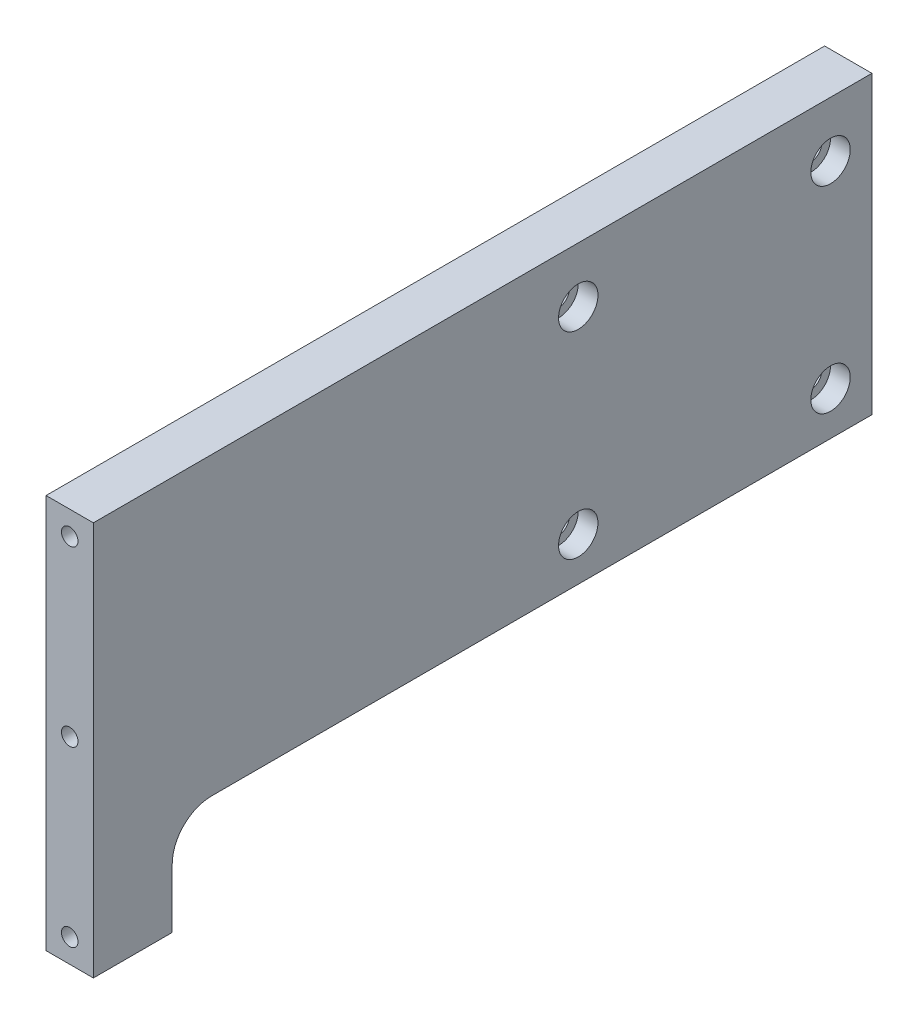
ISO-10303-21;
HEADER;
FILE_DESCRIPTION(('STEP AP214'),'2;1');
FILE_NAME('part.step','',(''),(''),'','','');
FILE_SCHEMA(('AUTOMOTIVE_DESIGN { 1 0 10303 214 1 1 1 1 }'));
ENDSEC;
DATA;
#1=APPLICATION_CONTEXT('core data for automotive mechanical design processes');
#2=APPLICATION_PROTOCOL_DEFINITION('international standard','automotive_design',2000,#1);
#3=PRODUCT_CONTEXT('',#1,'mechanical');
#4=PRODUCT('Part','Part','',(#3));
#5=PRODUCT_RELATED_PRODUCT_CATEGORY('part','',(#4));
#6=PRODUCT_DEFINITION_FORMATION('','',#4);
#7=PRODUCT_DEFINITION_CONTEXT('part definition',#1,'design');
#8=PRODUCT_DEFINITION('design','',#6,#7);
#9=PRODUCT_DEFINITION_SHAPE('','',#8);
#10=(LENGTH_UNIT() NAMED_UNIT(*) SI_UNIT(.MILLI.,.METRE.));
#11=(NAMED_UNIT(*) PLANE_ANGLE_UNIT() SI_UNIT($,.RADIAN.));
#12=(NAMED_UNIT(*) SI_UNIT($,.STERADIAN.) SOLID_ANGLE_UNIT());
#13=UNCERTAINTY_MEASURE_WITH_UNIT(LENGTH_MEASURE(1.E-05),#10,'distance_accuracy_value','');
#14=(GEOMETRIC_REPRESENTATION_CONTEXT(3) GLOBAL_UNCERTAINTY_ASSIGNED_CONTEXT((#13)) GLOBAL_UNIT_ASSIGNED_CONTEXT((#10,
#11,#12)) REPRESENTATION_CONTEXT('',''));
#15=CARTESIAN_POINT('',(0.,0.,0.));
#16=DIRECTION('',(0.,0.,1.));
#17=DIRECTION('',(1.,0.,0.));
#18=AXIS2_PLACEMENT_3D('',#15,#16,#17);
#19=CARTESIAN_POINT('',(12.,0.,0.));
#20=DIRECTION('',(0.,0.,-1.));
#21=DIRECTION('',(0.,1.,0.));
#22=AXIS2_PLACEMENT_3D('',#19,#20,#21);
#23=PLANE('',#22);
#24=CARTESIAN_POINT('',(6.,-6.,0.));
#25=DIRECTION('',(0.,0.,1.));
#26=DIRECTION('',(1.,0.,0.));
#27=AXIS2_PLACEMENT_3D('',#24,#25,#26);
#28=CIRCLE('',#27,2.09999999999999);
#29=CARTESIAN_POINT('',(8.09999999999999,-6.,0.));
#30=VERTEX_POINT('',#29);
#31=EDGE_CURVE('E113',#30,#30,#28,.T.);
#32=ORIENTED_EDGE('',*,*,#31,.F.);
#33=EDGE_LOOP('',(#32));
#34=FACE_BOUND('',#33,.T.);
#35=CARTESIAN_POINT('',(6.,-50.,0.));
#36=DIRECTION('',(0.,0.,1.));
#37=DIRECTION('',(1.,0.,0.));
#38=AXIS2_PLACEMENT_3D('',#35,#36,#37);
#39=CIRCLE('',#38,2.09999999999999);
#40=CARTESIAN_POINT('',(8.09999999999999,-50.,0.));
#41=VERTEX_POINT('',#40);
#42=EDGE_CURVE('E112',#41,#41,#39,.T.);
#43=ORIENTED_EDGE('',*,*,#42,.F.);
#44=EDGE_LOOP('',(#43));
#45=FACE_BOUND('',#44,.T.);
#46=CARTESIAN_POINT('',(6.,-94.,0.));
#47=DIRECTION('',(0.,0.,1.));
#48=DIRECTION('',(1.,0.,0.));
#49=AXIS2_PLACEMENT_3D('',#46,#47,#48);
#50=CIRCLE('',#49,2.09999999999999);
#51=CARTESIAN_POINT('',(8.09999999999999,-94.,0.));
#52=VERTEX_POINT('',#51);
#53=EDGE_CURVE('E125',#52,#52,#50,.T.);
#54=ORIENTED_EDGE('',*,*,#53,.F.);
#55=EDGE_LOOP('',(#54));
#56=FACE_BOUND('',#55,.T.);
#57=DIRECTION('',(0.,-1.,0.));
#58=VECTOR('',#57,1.);
#59=CARTESIAN_POINT('',(0.,0.,0.));
#60=LINE('',#59,#58);
#61=CARTESIAN_POINT('',(0.,0.,0.));
#62=VERTEX_POINT('',#61);
#63=CARTESIAN_POINT('',(0.,-100.,0.));
#64=VERTEX_POINT('',#63);
#65=EDGE_CURVE('E131',#62,#64,#60,.T.);
#66=ORIENTED_EDGE('',*,*,#65,.T.);
#67=DIRECTION('',(-1.,0.,0.));
#68=VECTOR('',#67,1.);
#69=CARTESIAN_POINT('',(12.,-100.,0.));
#70=LINE('',#69,#68);
#71=CARTESIAN_POINT('',(12.,-100.,0.));
#72=VERTEX_POINT('',#71);
#73=EDGE_CURVE('E169',#72,#64,#70,.T.);
#74=ORIENTED_EDGE('',*,*,#73,.F.);
#75=DIRECTION('',(0.,-1.,0.));
#76=VECTOR('',#75,1.);
#77=CARTESIAN_POINT('',(12.,0.,0.));
#78=LINE('',#77,#76);
#79=CARTESIAN_POINT('',(12.,0.,0.));
#80=VERTEX_POINT('',#79);
#81=EDGE_CURVE('E132',#80,#72,#78,.T.);
#82=ORIENTED_EDGE('',*,*,#81,.F.);
#83=DIRECTION('',(-1.,0.,0.));
#84=VECTOR('',#83,1.);
#85=CARTESIAN_POINT('',(12.,0.,0.));
#86=LINE('',#85,#84);
#87=EDGE_CURVE('E146',#80,#62,#86,.T.);
#88=ORIENTED_EDGE('',*,*,#87,.T.);
#89=EDGE_LOOP('',(#66,#74,#82,#88));
#90=FACE_BOUND('',#89,.T.);
#91=ADVANCED_FACE('F36',(#34,#45,#56,#90),#23,.F.);
#92=CARTESIAN_POINT('',(12.,-100.,0.));
#93=DIRECTION('',(0.,1.,0.));
#94=DIRECTION('',(0.,0.,1.));
#95=AXIS2_PLACEMENT_3D('',#92,#93,#94);
#96=PLANE('',#95);
#97=DIRECTION('',(0.,0.,-1.));
#98=VECTOR('',#97,1.);
#99=CARTESIAN_POINT('',(0.,-100.,0.));
#100=LINE('',#99,#98);
#101=CARTESIAN_POINT('',(0.,-100.,-20.));
#102=VERTEX_POINT('',#101);
#103=EDGE_CURVE('E149',#64,#102,#100,.T.);
#104=ORIENTED_EDGE('',*,*,#103,.T.);
#105=DIRECTION('',(-1.,0.,0.));
#106=VECTOR('',#105,1.);
#107=CARTESIAN_POINT('',(12.,-100.,-20.));
#108=LINE('',#107,#106);
#109=CARTESIAN_POINT('',(12.,-100.,-20.));
#110=VERTEX_POINT('',#109);
#111=EDGE_CURVE('E166',#110,#102,#108,.T.);
#112=ORIENTED_EDGE('',*,*,#111,.F.);
#113=DIRECTION('',(0.,0.,-1.));
#114=VECTOR('',#113,1.);
#115=CARTESIAN_POINT('',(12.,-100.,0.));
#116=LINE('',#115,#114);
#117=EDGE_CURVE('E135',#72,#110,#116,.T.);
#118=ORIENTED_EDGE('',*,*,#117,.F.);
#119=ORIENTED_EDGE('',*,*,#73,.T.);
#120=EDGE_LOOP('',(#104,#112,#118,#119));
#121=FACE_BOUND('',#120,.T.);
#122=ADVANCED_FACE('F210',(#121),#96,.F.);
#123=CARTESIAN_POINT('',(12.,-75.,-20.));
#124=DIRECTION('',(0.,0.,1.));
#125=DIRECTION('',(0.,-1.,0.));
#126=AXIS2_PLACEMENT_3D('',#123,#124,#125);
#127=PLANE('',#126);
#128=DIRECTION('',(0.,1.,0.));
#129=VECTOR('',#128,1.);
#130=CARTESIAN_POINT('',(0.,-75.,-20.));
#131=LINE('',#130,#129);
#132=CARTESIAN_POINT('',(0.,-85.,-20.));
#133=VERTEX_POINT('',#132);
#134=EDGE_CURVE('E151',#102,#133,#131,.T.);
#135=ORIENTED_EDGE('',*,*,#134,.T.);
#136=DIRECTION('',(-1.,0.,0.));
#137=VECTOR('',#136,1.);
#138=CARTESIAN_POINT('',(12.,-85.,-20.));
#139=LINE('',#138,#137);
#140=CARTESIAN_POINT('',(12.,-85.,-20.));
#141=VERTEX_POINT('',#140);
#142=EDGE_CURVE('E51',#133,#141,#139,.F.);
#143=ORIENTED_EDGE('',*,*,#142,.T.);
#144=DIRECTION('',(0.,1.,0.));
#145=VECTOR('',#144,1.);
#146=CARTESIAN_POINT('',(12.,-75.,-20.));
#147=LINE('',#146,#145);
#148=EDGE_CURVE('E138',#110,#141,#147,.T.);
#149=ORIENTED_EDGE('',*,*,#148,.F.);
#150=ORIENTED_EDGE('',*,*,#111,.T.);
#151=EDGE_LOOP('',(#135,#143,#149,#150));
#152=FACE_BOUND('',#151,.T.);
#153=ADVANCED_FACE('F215',(#152),#127,.F.);
#154=CARTESIAN_POINT('',(12.,-75.,-197.5));
#155=DIRECTION('',(0.,1.,0.));
#156=DIRECTION('',(0.,0.,1.));
#157=AXIS2_PLACEMENT_3D('',#154,#155,#156);
#158=PLANE('',#157);
#159=DIRECTION('',(0.,0.,-1.));
#160=VECTOR('',#159,1.);
#161=CARTESIAN_POINT('',(12.,-75.,-197.5));
#162=LINE('',#161,#160);
#163=CARTESIAN_POINT('',(12.,-75.,-30.));
#164=VERTEX_POINT('',#163);
#165=CARTESIAN_POINT('',(12.,-75.,-197.5));
#166=VERTEX_POINT('',#165);
#167=EDGE_CURVE('E140',#164,#166,#162,.T.);
#168=ORIENTED_EDGE('',*,*,#167,.F.);
#169=DIRECTION('',(-1.,0.,0.));
#170=VECTOR('',#169,1.);
#171=CARTESIAN_POINT('',(0.,-75.,-30.));
#172=LINE('',#171,#170);
#173=CARTESIAN_POINT('',(0.,-75.,-30.));
#174=VERTEX_POINT('',#173);
#175=EDGE_CURVE('E172',#164,#174,#172,.T.);
#176=ORIENTED_EDGE('',*,*,#175,.T.);
#177=DIRECTION('',(0.,0.,-1.));
#178=VECTOR('',#177,1.);
#179=CARTESIAN_POINT('',(0.,-75.,-197.5));
#180=LINE('',#179,#178);
#181=CARTESIAN_POINT('',(0.,-75.,-197.5));
#182=VERTEX_POINT('',#181);
#183=EDGE_CURVE('E153',#174,#182,#180,.T.);
#184=ORIENTED_EDGE('',*,*,#183,.T.);
#185=DIRECTION('',(-1.,0.,0.));
#186=VECTOR('',#185,1.);
#187=CARTESIAN_POINT('',(12.,-75.,-197.5));
#188=LINE('',#187,#186);
#189=EDGE_CURVE('E163',#166,#182,#188,.T.);
#190=ORIENTED_EDGE('',*,*,#189,.F.);
#191=EDGE_LOOP('',(#168,#176,#184,#190));
#192=FACE_BOUND('',#191,.T.);
#193=ADVANCED_FACE('F178',(#192),#158,.F.);
#194=CARTESIAN_POINT('',(12.,0.,-197.5));
#195=DIRECTION('',(0.,0.,1.));
#196=DIRECTION('',(1.,0.,0.));
#197=AXIS2_PLACEMENT_3D('',#194,#195,#196);
#198=PLANE('',#197);
#199=DIRECTION('',(0.,1.,0.));
#200=VECTOR('',#199,1.);
#201=CARTESIAN_POINT('',(0.,0.,-197.5));
#202=LINE('',#201,#200);
#203=CARTESIAN_POINT('',(0.,0.,-197.5));
#204=VERTEX_POINT('',#203);
#205=EDGE_CURVE('E155',#182,#204,#202,.T.);
#206=ORIENTED_EDGE('',*,*,#205,.T.);
#207=DIRECTION('',(-1.,0.,0.));
#208=VECTOR('',#207,1.);
#209=CARTESIAN_POINT('',(12.,0.,-197.5));
#210=LINE('',#209,#208);
#211=CARTESIAN_POINT('',(12.,0.,-197.5));
#212=VERTEX_POINT('',#211);
#213=EDGE_CURVE('E160',#212,#204,#210,.T.);
#214=ORIENTED_EDGE('',*,*,#213,.F.);
#215=DIRECTION('',(0.,1.,0.));
#216=VECTOR('',#215,1.);
#217=CARTESIAN_POINT('',(12.,0.,-197.5));
#218=LINE('',#217,#216);
#219=EDGE_CURVE('E142',#166,#212,#218,.T.);
#220=ORIENTED_EDGE('',*,*,#219,.F.);
#221=ORIENTED_EDGE('',*,*,#189,.T.);
#222=EDGE_LOOP('',(#206,#214,#220,#221));
#223=FACE_BOUND('',#222,.T.);
#224=ADVANCED_FACE('F188',(#223),#198,.F.);
#225=CARTESIAN_POINT('',(12.,0.,0.));
#226=DIRECTION('',(0.,-1.,0.));
#227=DIRECTION('',(0.,0.,-1.));
#228=AXIS2_PLACEMENT_3D('',#225,#226,#227);
#229=PLANE('',#228);
#230=DIRECTION('',(0.,0.,1.));
#231=VECTOR('',#230,1.);
#232=CARTESIAN_POINT('',(0.,0.,0.));
#233=LINE('',#232,#231);
#234=EDGE_CURVE('E136',#204,#62,#233,.T.);
#235=ORIENTED_EDGE('',*,*,#234,.T.);
#236=ORIENTED_EDGE('',*,*,#87,.F.);
#237=DIRECTION('',(0.,0.,1.));
#238=VECTOR('',#237,1.);
#239=CARTESIAN_POINT('',(12.,0.,0.));
#240=LINE('',#239,#238);
#241=EDGE_CURVE('E144',#212,#80,#240,.T.);
#242=ORIENTED_EDGE('',*,*,#241,.F.);
#243=ORIENTED_EDGE('',*,*,#213,.T.);
#244=EDGE_LOOP('',(#235,#236,#242,#243));
#245=FACE_BOUND('',#244,.T.);
#246=ADVANCED_FACE('F192',(#245),#229,.F.);
#247=CARTESIAN_POINT('',(12.,-100.,0.));
#248=DIRECTION('',(1.,0.,0.));
#249=DIRECTION('',(0.,0.,-1.));
#250=AXIS2_PLACEMENT_3D('',#247,#248,#249);
#251=PLANE('',#250);
#252=CARTESIAN_POINT('',(12.,-14.,-123.));
#253=DIRECTION('',(1.,0.,0.));
#254=DIRECTION('',(0.,0.,-1.));
#255=AXIS2_PLACEMENT_3D('',#252,#253,#254);
#256=CIRCLE('',#255,4.99999999999999);
#257=CARTESIAN_POINT('',(12.,-14.,-128.));
#258=VERTEX_POINT('',#257);
#259=EDGE_CURVE('E299',#258,#258,#256,.T.);
#260=ORIENTED_EDGE('',*,*,#259,.F.);
#261=EDGE_LOOP('',(#260));
#262=FACE_BOUND('',#261,.T.);
#263=CARTESIAN_POINT('',(12.,-64.,-123.));
#264=DIRECTION('',(1.,0.,0.));
#265=DIRECTION('',(0.,0.,-1.));
#266=AXIS2_PLACEMENT_3D('',#263,#264,#265);
#267=CIRCLE('',#266,4.99999999999999);
#268=CARTESIAN_POINT('',(12.,-64.,-128.));
#269=VERTEX_POINT('',#268);
#270=EDGE_CURVE('E309',#269,#269,#267,.T.);
#271=ORIENTED_EDGE('',*,*,#270,.F.);
#272=EDGE_LOOP('',(#271));
#273=FACE_BOUND('',#272,.T.);
#274=CARTESIAN_POINT('',(12.,-64.,-187.));
#275=DIRECTION('',(1.,0.,0.));
#276=DIRECTION('',(0.,0.,-1.));
#277=AXIS2_PLACEMENT_3D('',#274,#275,#276);
#278=CIRCLE('',#277,4.99999999999999);
#279=CARTESIAN_POINT('',(12.,-64.,-192.));
#280=VERTEX_POINT('',#279);
#281=EDGE_CURVE('E321',#280,#280,#278,.T.);
#282=ORIENTED_EDGE('',*,*,#281,.F.);
#283=EDGE_LOOP('',(#282));
#284=FACE_BOUND('',#283,.T.);
#285=CARTESIAN_POINT('',(12.,-14.,-187.));
#286=DIRECTION('',(1.,0.,0.));
#287=DIRECTION('',(0.,0.,-1.));
#288=AXIS2_PLACEMENT_3D('',#285,#286,#287);
#289=CIRCLE('',#288,4.99999999999999);
#290=CARTESIAN_POINT('',(12.,-14.,-192.));
#291=VERTEX_POINT('',#290);
#292=EDGE_CURVE('E333',#291,#291,#289,.T.);
#293=ORIENTED_EDGE('',*,*,#292,.F.);
#294=EDGE_LOOP('',(#293));
#295=FACE_BOUND('',#294,.T.);
#296=ORIENTED_EDGE('',*,*,#81,.T.);
#297=ORIENTED_EDGE('',*,*,#117,.T.);
#298=ORIENTED_EDGE('',*,*,#148,.T.);
#299=CARTESIAN_POINT('',(12.,-85.,-30.));
#300=DIRECTION('',(1.,0.,0.));
#301=DIRECTION('',(0.,0.,-1.));
#302=AXIS2_PLACEMENT_3D('',#299,#300,#301);
#303=CIRCLE('',#302,10.);
#304=EDGE_CURVE('E11',#141,#164,#303,.F.);
#305=ORIENTED_EDGE('',*,*,#304,.T.);
#306=ORIENTED_EDGE('',*,*,#167,.T.);
#307=ORIENTED_EDGE('',*,*,#219,.T.);
#308=ORIENTED_EDGE('',*,*,#241,.T.);
#309=EDGE_LOOP('',(#296,#297,#298,#305,#306,#307,#308));
#310=FACE_BOUND('',#309,.T.);
#311=ADVANCED_FACE('F196',(#262,#273,#284,#295,#310),#251,.T.);
#312=CARTESIAN_POINT('',(0.,-100.,0.));
#313=DIRECTION('',(1.,0.,0.));
#314=DIRECTION('',(0.,0.,-1.));
#315=AXIS2_PLACEMENT_3D('',#312,#313,#314);
#316=PLANE('',#315);
#317=CARTESIAN_POINT('',(0.,-14.,-123.));
#318=DIRECTION('',(1.,0.,0.));
#319=DIRECTION('',(0.,0.,-1.));
#320=AXIS2_PLACEMENT_3D('',#317,#318,#319);
#321=CIRCLE('',#320,2.75);
#322=CARTESIAN_POINT('',(0.,-14.,-125.75));
#323=VERTEX_POINT('',#322);
#324=EDGE_CURVE('E306',#323,#323,#321,.T.);
#325=ORIENTED_EDGE('',*,*,#324,.T.);
#326=EDGE_LOOP('',(#325));
#327=FACE_BOUND('',#326,.T.);
#328=CARTESIAN_POINT('',(0.,-64.,-123.));
#329=DIRECTION('',(1.,0.,0.));
#330=DIRECTION('',(0.,0.,-1.));
#331=AXIS2_PLACEMENT_3D('',#328,#329,#330);
#332=CIRCLE('',#331,2.75);
#333=CARTESIAN_POINT('',(0.,-64.,-125.75));
#334=VERTEX_POINT('',#333);
#335=EDGE_CURVE('E318',#334,#334,#332,.T.);
#336=ORIENTED_EDGE('',*,*,#335,.T.);
#337=EDGE_LOOP('',(#336));
#338=FACE_BOUND('',#337,.T.);
#339=CARTESIAN_POINT('',(0.,-64.,-187.));
#340=DIRECTION('',(1.,0.,0.));
#341=DIRECTION('',(0.,0.,-1.));
#342=AXIS2_PLACEMENT_3D('',#339,#340,#341);
#343=CIRCLE('',#342,2.75);
#344=CARTESIAN_POINT('',(0.,-64.,-189.75));
#345=VERTEX_POINT('',#344);
#346=EDGE_CURVE('E330',#345,#345,#343,.T.);
#347=ORIENTED_EDGE('',*,*,#346,.T.);
#348=EDGE_LOOP('',(#347));
#349=FACE_BOUND('',#348,.T.);
#350=CARTESIAN_POINT('',(0.,-14.,-187.));
#351=DIRECTION('',(1.,0.,0.));
#352=DIRECTION('',(0.,0.,-1.));
#353=AXIS2_PLACEMENT_3D('',#350,#351,#352);
#354=CIRCLE('',#353,2.75);
#355=CARTESIAN_POINT('',(0.,-14.,-189.75));
#356=VERTEX_POINT('',#355);
#357=EDGE_CURVE('E119',#356,#356,#354,.T.);
#358=ORIENTED_EDGE('',*,*,#357,.T.);
#359=EDGE_LOOP('',(#358));
#360=FACE_BOUND('',#359,.T.);
#361=ORIENTED_EDGE('',*,*,#65,.F.);
#362=ORIENTED_EDGE('',*,*,#234,.F.);
#363=ORIENTED_EDGE('',*,*,#205,.F.);
#364=ORIENTED_EDGE('',*,*,#183,.F.);
#365=CARTESIAN_POINT('',(0.,-85.,-30.));
#366=DIRECTION('',(1.,0.,0.));
#367=DIRECTION('',(0.,0.,-1.));
#368=AXIS2_PLACEMENT_3D('',#365,#366,#367);
#369=CIRCLE('',#368,10.);
#370=EDGE_CURVE('E44',#174,#133,#369,.T.);
#371=ORIENTED_EDGE('',*,*,#370,.T.);
#372=ORIENTED_EDGE('',*,*,#134,.F.);
#373=ORIENTED_EDGE('',*,*,#103,.F.);
#374=EDGE_LOOP('',(#361,#362,#363,#364,#371,#372,#373));
#375=FACE_BOUND('',#374,.T.);
#376=ADVANCED_FACE('F184',(#327,#338,#349,#360,#375),#316,.F.);
#377=CARTESIAN_POINT('',(12.,-85.,-30.));
#378=DIRECTION('',(1.,0.,0.));
#379=DIRECTION('',(0.,0.,-1.));
#380=AXIS2_PLACEMENT_3D('',#377,#378,#379);
#381=CYLINDRICAL_SURFACE('',#380,10.);
#382=ORIENTED_EDGE('',*,*,#304,.F.);
#383=ORIENTED_EDGE('',*,*,#142,.F.);
#384=ORIENTED_EDGE('',*,*,#370,.F.);
#385=ORIENTED_EDGE('',*,*,#175,.F.);
#386=EDGE_LOOP('',(#382,#383,#384,#385));
#387=FACE_BOUND('',#386,.T.);
#388=ADVANCED_FACE('F38',(#387),#381,.F.);
#389=CARTESIAN_POINT('',(6.,-94.,-14.));
#390=DIRECTION('',(0.,0.,1.));
#391=DIRECTION('',(1.,0.,0.));
#392=AXIS2_PLACEMENT_3D('',#389,#390,#391);
#393=CONICAL_SURFACE('',#392,2.09999999999999,1.02974425867665);
#394=CARTESIAN_POINT('',(6.,-94.,-15.2618072999579));
#395=VERTEX_POINT('',#394);
#396=VERTEX_LOOP('',#395);
#397=FACE_BOUND('',#396,.T.);
#398=CARTESIAN_POINT('',(6.,-94.,-14.));
#399=DIRECTION('',(0.,0.,1.));
#400=DIRECTION('',(1.,0.,0.));
#401=AXIS2_PLACEMENT_3D('',#398,#399,#400);
#402=CIRCLE('',#401,2.09999999999999);
#403=CARTESIAN_POINT('',(8.09999999999999,-94.,-14.));
#404=VERTEX_POINT('',#403);
#405=EDGE_CURVE('E128',#404,#404,#402,.T.);
#406=ORIENTED_EDGE('',*,*,#405,.T.);
#407=EDGE_LOOP('',(#406));
#408=FACE_BOUND('',#407,.T.);
#409=ADVANCED_FACE('F199',(#397,#408),#393,.F.);
#410=CARTESIAN_POINT('',(6.,-94.,0.));
#411=DIRECTION('',(0.,0.,1.));
#412=DIRECTION('',(1.,0.,0.));
#413=AXIS2_PLACEMENT_3D('',#410,#411,#412);
#414=CYLINDRICAL_SURFACE('',#413,2.09999999999999);
#415=ORIENTED_EDGE('',*,*,#405,.F.);
#416=EDGE_LOOP('',(#415));
#417=FACE_BOUND('',#416,.T.);
#418=ORIENTED_EDGE('',*,*,#53,.T.);
#419=EDGE_LOOP('',(#418));
#420=FACE_BOUND('',#419,.T.);
#421=ADVANCED_FACE('F204',(#417,#420),#414,.F.);
#422=CARTESIAN_POINT('',(6.,-50.,-14.));
#423=DIRECTION('',(0.,0.,1.));
#424=DIRECTION('',(1.,0.,0.));
#425=AXIS2_PLACEMENT_3D('',#422,#423,#424);
#426=CONICAL_SURFACE('',#425,2.09999999999999,1.02974425867665);
#427=CARTESIAN_POINT('',(6.,-50.,-15.2618072999579));
#428=VERTEX_POINT('',#427);
#429=VERTEX_LOOP('',#428);
#430=FACE_BOUND('',#429,.T.);
#431=CARTESIAN_POINT('',(6.,-50.,-14.));
#432=DIRECTION('',(0.,0.,1.));
#433=DIRECTION('',(1.,0.,0.));
#434=AXIS2_PLACEMENT_3D('',#431,#432,#433);
#435=CIRCLE('',#434,2.09999999999999);
#436=CARTESIAN_POINT('',(8.09999999999999,-50.,-14.));
#437=VERTEX_POINT('',#436);
#438=EDGE_CURVE('E116',#437,#437,#435,.T.);
#439=ORIENTED_EDGE('',*,*,#438,.T.);
#440=EDGE_LOOP('',(#439));
#441=FACE_BOUND('',#440,.T.);
#442=ADVANCED_FACE('F234',(#430,#441),#426,.F.);
#443=CARTESIAN_POINT('',(6.,-50.,0.));
#444=DIRECTION('',(0.,0.,1.));
#445=DIRECTION('',(1.,0.,0.));
#446=AXIS2_PLACEMENT_3D('',#443,#444,#445);
#447=CYLINDRICAL_SURFACE('',#446,2.09999999999999);
#448=ORIENTED_EDGE('',*,*,#438,.F.);
#449=EDGE_LOOP('',(#448));
#450=FACE_BOUND('',#449,.T.);
#451=ORIENTED_EDGE('',*,*,#42,.T.);
#452=EDGE_LOOP('',(#451));
#453=FACE_BOUND('',#452,.T.);
#454=ADVANCED_FACE('F106',(#450,#453),#447,.F.);
#455=CARTESIAN_POINT('',(6.,-6.,-14.));
#456=DIRECTION('',(0.,0.,1.));
#457=DIRECTION('',(1.,0.,0.));
#458=AXIS2_PLACEMENT_3D('',#455,#456,#457);
#459=CONICAL_SURFACE('',#458,2.09999999999999,1.02974425867665);
#460=CARTESIAN_POINT('',(6.,-6.,-15.2618072999579));
#461=VERTEX_POINT('',#460);
#462=VERTEX_LOOP('',#461);
#463=FACE_BOUND('',#462,.T.);
#464=CARTESIAN_POINT('',(6.,-6.,-14.));
#465=DIRECTION('',(0.,0.,1.));
#466=DIRECTION('',(1.,0.,0.));
#467=AXIS2_PLACEMENT_3D('',#464,#465,#466);
#468=CIRCLE('',#467,2.09999999999999);
#469=CARTESIAN_POINT('',(8.09999999999999,-6.,-14.));
#470=VERTEX_POINT('',#469);
#471=EDGE_CURVE('E110',#470,#470,#468,.T.);
#472=ORIENTED_EDGE('',*,*,#471,.T.);
#473=EDGE_LOOP('',(#472));
#474=FACE_BOUND('',#473,.T.);
#475=ADVANCED_FACE('F102',(#463,#474),#459,.F.);
#476=CARTESIAN_POINT('',(6.,-6.,0.));
#477=DIRECTION('',(0.,0.,1.));
#478=DIRECTION('',(1.,0.,0.));
#479=AXIS2_PLACEMENT_3D('',#476,#477,#478);
#480=CYLINDRICAL_SURFACE('',#479,2.09999999999999);
#481=ORIENTED_EDGE('',*,*,#471,.F.);
#482=EDGE_LOOP('',(#481));
#483=FACE_BOUND('',#482,.T.);
#484=ORIENTED_EDGE('',*,*,#31,.T.);
#485=EDGE_LOOP('',(#484));
#486=FACE_BOUND('',#485,.T.);
#487=ADVANCED_FACE('F105',(#483,#486),#480,.F.);
#488=CARTESIAN_POINT('',(12.,-14.,-187.));
#489=DIRECTION('',(1.,0.,0.));
#490=DIRECTION('',(0.,0.,-1.));
#491=AXIS2_PLACEMENT_3D('',#488,#489,#490);
#492=CYLINDRICAL_SURFACE('',#491,2.75);
#493=ORIENTED_EDGE('',*,*,#357,.F.);
#494=EDGE_LOOP('',(#493));
#495=FACE_BOUND('',#494,.T.);
#496=CARTESIAN_POINT('',(7.,-14.,-187.));
#497=DIRECTION('',(1.,0.,0.));
#498=DIRECTION('',(0.,0.,-1.));
#499=AXIS2_PLACEMENT_3D('',#496,#497,#498);
#500=CIRCLE('',#499,2.75000000000001);
#501=CARTESIAN_POINT('',(7.,-14.,-189.75));
#502=VERTEX_POINT('',#501);
#503=EDGE_CURVE('E339',#502,#502,#500,.T.);
#504=ORIENTED_EDGE('',*,*,#503,.T.);
#505=EDGE_LOOP('',(#504));
#506=FACE_BOUND('',#505,.T.);
#507=ADVANCED_FACE('F244',(#495,#506),#492,.F.);
#508=CARTESIAN_POINT('',(7.,-11.25,-187.));
#509=DIRECTION('',(-1.,0.,0.));
#510=DIRECTION('',(0.,0.,1.));
#511=AXIS2_PLACEMENT_3D('',#508,#509,#510);
#512=PLANE('',#511);
#513=ORIENTED_EDGE('',*,*,#503,.F.);
#514=EDGE_LOOP('',(#513));
#515=FACE_BOUND('',#514,.T.);
#516=CARTESIAN_POINT('',(7.,-14.,-187.));
#517=DIRECTION('',(1.,0.,0.));
#518=DIRECTION('',(0.,0.,-1.));
#519=AXIS2_PLACEMENT_3D('',#516,#517,#518);
#520=CIRCLE('',#519,4.99999999999999);
#521=CARTESIAN_POINT('',(7.,-14.,-192.));
#522=VERTEX_POINT('',#521);
#523=EDGE_CURVE('E336',#522,#522,#520,.T.);
#524=ORIENTED_EDGE('',*,*,#523,.T.);
#525=EDGE_LOOP('',(#524));
#526=FACE_BOUND('',#525,.T.);
#527=ADVANCED_FACE('F247',(#515,#526),#512,.F.);
#528=CARTESIAN_POINT('',(12.,-14.,-187.));
#529=DIRECTION('',(1.,0.,0.));
#530=DIRECTION('',(0.,0.,-1.));
#531=AXIS2_PLACEMENT_3D('',#528,#529,#530);
#532=CYLINDRICAL_SURFACE('',#531,4.99999999999999);
#533=ORIENTED_EDGE('',*,*,#523,.F.);
#534=EDGE_LOOP('',(#533));
#535=FACE_BOUND('',#534,.T.);
#536=ORIENTED_EDGE('',*,*,#292,.T.);
#537=EDGE_LOOP('',(#536));
#538=FACE_BOUND('',#537,.T.);
#539=ADVANCED_FACE('F251',(#535,#538),#532,.F.);
#540=CARTESIAN_POINT('',(12.,-64.,-187.));
#541=DIRECTION('',(1.,0.,0.));
#542=DIRECTION('',(0.,0.,-1.));
#543=AXIS2_PLACEMENT_3D('',#540,#541,#542);
#544=CYLINDRICAL_SURFACE('',#543,2.75);
#545=ORIENTED_EDGE('',*,*,#346,.F.);
#546=EDGE_LOOP('',(#545));
#547=FACE_BOUND('',#546,.T.);
#548=CARTESIAN_POINT('',(7.,-64.,-187.));
#549=DIRECTION('',(1.,0.,0.));
#550=DIRECTION('',(0.,0.,-1.));
#551=AXIS2_PLACEMENT_3D('',#548,#549,#550);
#552=CIRCLE('',#551,2.75000000000001);
#553=CARTESIAN_POINT('',(7.,-64.,-189.75));
#554=VERTEX_POINT('',#553);
#555=EDGE_CURVE('E327',#554,#554,#552,.T.);
#556=ORIENTED_EDGE('',*,*,#555,.T.);
#557=EDGE_LOOP('',(#556));
#558=FACE_BOUND('',#557,.T.);
#559=ADVANCED_FACE('F255',(#547,#558),#544,.F.);
#560=CARTESIAN_POINT('',(7.,-61.25,-187.));
#561=DIRECTION('',(-1.,0.,0.));
#562=DIRECTION('',(0.,0.,1.));
#563=AXIS2_PLACEMENT_3D('',#560,#561,#562);
#564=PLANE('',#563);
#565=ORIENTED_EDGE('',*,*,#555,.F.);
#566=EDGE_LOOP('',(#565));
#567=FACE_BOUND('',#566,.T.);
#568=CARTESIAN_POINT('',(7.,-64.,-187.));
#569=DIRECTION('',(1.,0.,0.));
#570=DIRECTION('',(0.,0.,-1.));
#571=AXIS2_PLACEMENT_3D('',#568,#569,#570);
#572=CIRCLE('',#571,4.99999999999999);
#573=CARTESIAN_POINT('',(7.,-64.,-192.));
#574=VERTEX_POINT('',#573);
#575=EDGE_CURVE('E324',#574,#574,#572,.T.);
#576=ORIENTED_EDGE('',*,*,#575,.T.);
#577=EDGE_LOOP('',(#576));
#578=FACE_BOUND('',#577,.T.);
#579=ADVANCED_FACE('F259',(#567,#578),#564,.F.);
#580=CARTESIAN_POINT('',(12.,-64.,-187.));
#581=DIRECTION('',(1.,0.,0.));
#582=DIRECTION('',(0.,0.,-1.));
#583=AXIS2_PLACEMENT_3D('',#580,#581,#582);
#584=CYLINDRICAL_SURFACE('',#583,4.99999999999999);
#585=ORIENTED_EDGE('',*,*,#575,.F.);
#586=EDGE_LOOP('',(#585));
#587=FACE_BOUND('',#586,.T.);
#588=ORIENTED_EDGE('',*,*,#281,.T.);
#589=EDGE_LOOP('',(#588));
#590=FACE_BOUND('',#589,.T.);
#591=ADVANCED_FACE('F263',(#587,#590),#584,.F.);
#592=CARTESIAN_POINT('',(12.,-64.,-123.));
#593=DIRECTION('',(1.,0.,0.));
#594=DIRECTION('',(0.,0.,-1.));
#595=AXIS2_PLACEMENT_3D('',#592,#593,#594);
#596=CYLINDRICAL_SURFACE('',#595,2.75);
#597=ORIENTED_EDGE('',*,*,#335,.F.);
#598=EDGE_LOOP('',(#597));
#599=FACE_BOUND('',#598,.T.);
#600=CARTESIAN_POINT('',(7.,-64.,-123.));
#601=DIRECTION('',(1.,0.,0.));
#602=DIRECTION('',(0.,0.,-1.));
#603=AXIS2_PLACEMENT_3D('',#600,#601,#602);
#604=CIRCLE('',#603,2.75000000000001);
#605=CARTESIAN_POINT('',(7.,-64.,-125.75));
#606=VERTEX_POINT('',#605);
#607=EDGE_CURVE('E315',#606,#606,#604,.T.);
#608=ORIENTED_EDGE('',*,*,#607,.T.);
#609=EDGE_LOOP('',(#608));
#610=FACE_BOUND('',#609,.T.);
#611=ADVANCED_FACE('F267',(#599,#610),#596,.F.);
#612=CARTESIAN_POINT('',(7.,-61.25,-123.));
#613=DIRECTION('',(-1.,0.,0.));
#614=DIRECTION('',(0.,0.,1.));
#615=AXIS2_PLACEMENT_3D('',#612,#613,#614);
#616=PLANE('',#615);
#617=ORIENTED_EDGE('',*,*,#607,.F.);
#618=EDGE_LOOP('',(#617));
#619=FACE_BOUND('',#618,.T.);
#620=CARTESIAN_POINT('',(7.,-64.,-123.));
#621=DIRECTION('',(1.,0.,0.));
#622=DIRECTION('',(0.,0.,-1.));
#623=AXIS2_PLACEMENT_3D('',#620,#621,#622);
#624=CIRCLE('',#623,4.99999999999999);
#625=CARTESIAN_POINT('',(7.,-64.,-128.));
#626=VERTEX_POINT('',#625);
#627=EDGE_CURVE('E312',#626,#626,#624,.T.);
#628=ORIENTED_EDGE('',*,*,#627,.T.);
#629=EDGE_LOOP('',(#628));
#630=FACE_BOUND('',#629,.T.);
#631=ADVANCED_FACE('F271',(#619,#630),#616,.F.);
#632=CARTESIAN_POINT('',(12.,-64.,-123.));
#633=DIRECTION('',(1.,0.,0.));
#634=DIRECTION('',(0.,0.,-1.));
#635=AXIS2_PLACEMENT_3D('',#632,#633,#634);
#636=CYLINDRICAL_SURFACE('',#635,4.99999999999999);
#637=ORIENTED_EDGE('',*,*,#627,.F.);
#638=EDGE_LOOP('',(#637));
#639=FACE_BOUND('',#638,.T.);
#640=ORIENTED_EDGE('',*,*,#270,.T.);
#641=EDGE_LOOP('',(#640));
#642=FACE_BOUND('',#641,.T.);
#643=ADVANCED_FACE('F275',(#639,#642),#636,.F.);
#644=CARTESIAN_POINT('',(12.,-14.,-123.));
#645=DIRECTION('',(1.,0.,0.));
#646=DIRECTION('',(0.,0.,-1.));
#647=AXIS2_PLACEMENT_3D('',#644,#645,#646);
#648=CYLINDRICAL_SURFACE('',#647,2.75);
#649=ORIENTED_EDGE('',*,*,#324,.F.);
#650=EDGE_LOOP('',(#649));
#651=FACE_BOUND('',#650,.T.);
#652=CARTESIAN_POINT('',(7.,-14.,-123.));
#653=DIRECTION('',(1.,0.,0.));
#654=DIRECTION('',(0.,0.,-1.));
#655=AXIS2_PLACEMENT_3D('',#652,#653,#654);
#656=CIRCLE('',#655,2.75000000000001);
#657=CARTESIAN_POINT('',(7.,-14.,-125.75));
#658=VERTEX_POINT('',#657);
#659=EDGE_CURVE('E301',#658,#658,#656,.T.);
#660=ORIENTED_EDGE('',*,*,#659,.T.);
#661=EDGE_LOOP('',(#660));
#662=FACE_BOUND('',#661,.T.);
#663=ADVANCED_FACE('F279',(#651,#662),#648,.F.);
#664=CARTESIAN_POINT('',(7.,-11.25,-123.));
#665=DIRECTION('',(-1.,0.,0.));
#666=DIRECTION('',(0.,0.,1.));
#667=AXIS2_PLACEMENT_3D('',#664,#665,#666);
#668=PLANE('',#667);
#669=ORIENTED_EDGE('',*,*,#659,.F.);
#670=EDGE_LOOP('',(#669));
#671=FACE_BOUND('',#670,.T.);
#672=CARTESIAN_POINT('',(7.,-14.,-123.));
#673=DIRECTION('',(1.,0.,0.));
#674=DIRECTION('',(0.,0.,-1.));
#675=AXIS2_PLACEMENT_3D('',#672,#673,#674);
#676=CIRCLE('',#675,4.99999999999999);
#677=CARTESIAN_POINT('',(7.,-14.,-128.));
#678=VERTEX_POINT('',#677);
#679=EDGE_CURVE('E296',#678,#678,#676,.T.);
#680=ORIENTED_EDGE('',*,*,#679,.T.);
#681=EDGE_LOOP('',(#680));
#682=FACE_BOUND('',#681,.T.);
#683=ADVANCED_FACE('F283',(#671,#682),#668,.F.);
#684=CARTESIAN_POINT('',(12.,-14.,-123.));
#685=DIRECTION('',(1.,0.,0.));
#686=DIRECTION('',(0.,0.,-1.));
#687=AXIS2_PLACEMENT_3D('',#684,#685,#686);
#688=CYLINDRICAL_SURFACE('',#687,4.99999999999999);
#689=ORIENTED_EDGE('',*,*,#679,.F.);
#690=EDGE_LOOP('',(#689));
#691=FACE_BOUND('',#690,.T.);
#692=ORIENTED_EDGE('',*,*,#259,.T.);
#693=EDGE_LOOP('',(#692));
#694=FACE_BOUND('',#693,.T.);
#695=ADVANCED_FACE('F287',(#691,#694),#688,.F.);
#696=CLOSED_SHELL('',(#91,#122,#153,#193,#224,#246,#311,#376,#388,#409,#421,#442,#454,#475,#487,
#507,#527,#539,#559,#579,#591,#611,#631,#643,#663,#683,#695));
#697=MANIFOLD_SOLID_BREP('B2',#696);
#698=ADVANCED_BREP_SHAPE_REPRESENTATION('',(#18,#697),#14);
#699=SHAPE_DEFINITION_REPRESENTATION(#9,#698);
ENDSEC;
END-ISO-10303-21;
